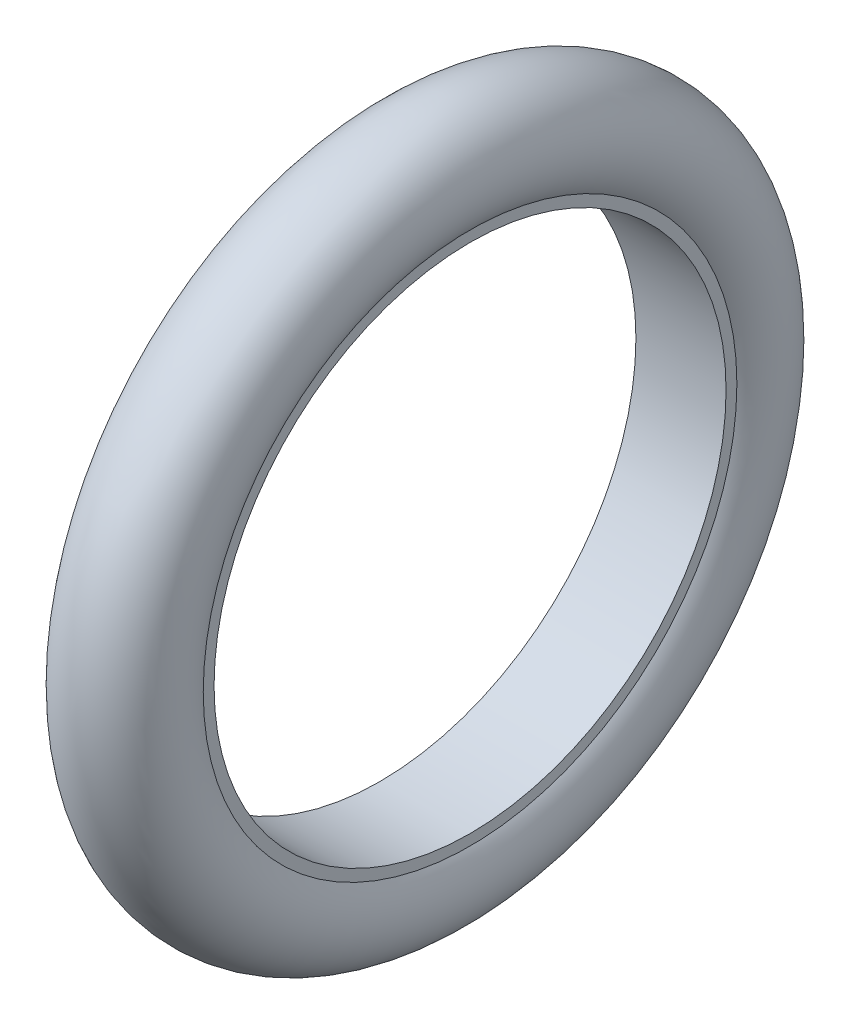
ISO-10303-21;
HEADER;
FILE_DESCRIPTION(('STEP AP214'),'2;1');
FILE_NAME('part.step','',(''),(''),'','','');
FILE_SCHEMA(('AUTOMOTIVE_DESIGN { 1 0 10303 214 1 1 1 1 }'));
ENDSEC;
DATA;
#1=APPLICATION_CONTEXT('core data for automotive mechanical design processes');
#2=APPLICATION_PROTOCOL_DEFINITION('international standard','automotive_design',2000,#1);
#3=PRODUCT_CONTEXT('',#1,'mechanical');
#4=PRODUCT('Part','Part','',(#3));
#5=PRODUCT_RELATED_PRODUCT_CATEGORY('part','',(#4));
#6=PRODUCT_DEFINITION_FORMATION('','',#4);
#7=PRODUCT_DEFINITION_CONTEXT('part definition',#1,'design');
#8=PRODUCT_DEFINITION('design','',#6,#7);
#9=PRODUCT_DEFINITION_SHAPE('','',#8);
#10=(LENGTH_UNIT() NAMED_UNIT(*) SI_UNIT(.MILLI.,.METRE.));
#11=(NAMED_UNIT(*) PLANE_ANGLE_UNIT() SI_UNIT($,.RADIAN.));
#12=(NAMED_UNIT(*) SI_UNIT($,.STERADIAN.) SOLID_ANGLE_UNIT());
#13=UNCERTAINTY_MEASURE_WITH_UNIT(LENGTH_MEASURE(1.E-05),#10,'distance_accuracy_value','');
#14=(GEOMETRIC_REPRESENTATION_CONTEXT(3) GLOBAL_UNCERTAINTY_ASSIGNED_CONTEXT((#13)) GLOBAL_UNIT_ASSIGNED_CONTEXT((#10,
#11,#12)) REPRESENTATION_CONTEXT('',''));
#15=CARTESIAN_POINT('',(0.,0.,0.));
#16=DIRECTION('',(0.,0.,1.));
#17=DIRECTION('',(1.,0.,0.));
#18=AXIS2_PLACEMENT_3D('',#15,#16,#17);
#19=CARTESIAN_POINT('',(0.,0.,0.));
#20=DIRECTION('',(-1.,0.,0.));
#21=DIRECTION('',(0.,0.,1.));
#22=AXIS2_PLACEMENT_3D('',#19,#20,#21);
#23=TOROIDAL_SURFACE('',#22,83.1651513899117,15.5);
#24=CARTESIAN_POINT('',(-12.5,0.,0.));
#25=DIRECTION('',(-1.,0.,0.));
#26=DIRECTION('',(0.,0.,1.));
#27=AXIS2_PLACEMENT_3D('',#24,#25,#26);
#28=CIRCLE('',#27,74.);
#29=CARTESIAN_POINT('',(-12.5,0.,74.));
#30=VERTEX_POINT('',#29);
#31=EDGE_CURVE('E10',#30,#30,#28,.T.);
#32=ORIENTED_EDGE('',*,*,#31,.F.);
#33=EDGE_LOOP('',(#32));
#34=FACE_BOUND('',#33,.T.);
#35=CARTESIAN_POINT('',(12.5,0.,0.));
#36=DIRECTION('',(-1.,0.,0.));
#37=DIRECTION('',(0.,0.,1.));
#38=AXIS2_PLACEMENT_3D('',#35,#36,#37);
#39=CIRCLE('',#38,74.);
#40=CARTESIAN_POINT('',(12.5,0.,74.));
#41=VERTEX_POINT('',#40);
#42=EDGE_CURVE('E58',#41,#41,#39,.T.);
#43=ORIENTED_EDGE('',*,*,#42,.T.);
#44=EDGE_LOOP('',(#43));
#45=FACE_BOUND('',#44,.T.);
#46=ADVANCED_FACE('F43',(#34,#45),#23,.T.);
#47=CARTESIAN_POINT('',(-12.5,74.,0.));
#48=DIRECTION('',(1.,0.,0.));
#49=DIRECTION('',(0.,0.,-1.));
#50=AXIS2_PLACEMENT_3D('',#47,#48,#49);
#51=PLANE('',#50);
#52=CARTESIAN_POINT('',(-12.5,0.,0.));
#53=DIRECTION('',(-1.,0.,0.));
#54=DIRECTION('',(0.,0.,1.));
#55=AXIS2_PLACEMENT_3D('',#52,#53,#54);
#56=CIRCLE('',#55,71.);
#57=CARTESIAN_POINT('',(-12.5,0.,71.));
#58=VERTEX_POINT('',#57);
#59=EDGE_CURVE('E49',#58,#58,#56,.T.);
#60=ORIENTED_EDGE('',*,*,#59,.F.);
#61=EDGE_LOOP('',(#60));
#62=FACE_BOUND('',#61,.T.);
#63=ORIENTED_EDGE('',*,*,#31,.T.);
#64=EDGE_LOOP('',(#63));
#65=FACE_BOUND('',#64,.T.);
#66=ADVANCED_FACE('F78',(#62,#65),#51,.F.);
#67=CARTESIAN_POINT('',(-32.6304890177472,0.,0.));
#68=DIRECTION('',(-1.,0.,0.));
#69=DIRECTION('',(0.,0.,1.));
#70=AXIS2_PLACEMENT_3D('',#67,#68,#69);
#71=CYLINDRICAL_SURFACE('',#70,71.);
#72=CARTESIAN_POINT('',(12.5,0.,0.));
#73=DIRECTION('',(-1.,0.,0.));
#74=DIRECTION('',(0.,0.,1.));
#75=AXIS2_PLACEMENT_3D('',#72,#73,#74);
#76=CIRCLE('',#75,71.);
#77=CARTESIAN_POINT('',(12.5,0.,71.));
#78=VERTEX_POINT('',#77);
#79=EDGE_CURVE('E54',#78,#78,#76,.T.);
#80=ORIENTED_EDGE('',*,*,#79,.F.);
#81=EDGE_LOOP('',(#80));
#82=FACE_BOUND('',#81,.T.);
#83=ORIENTED_EDGE('',*,*,#59,.T.);
#84=EDGE_LOOP('',(#83));
#85=FACE_BOUND('',#84,.T.);
#86=ADVANCED_FACE('F71',(#82,#85),#71,.F.);
#87=CARTESIAN_POINT('',(12.5,71.,0.));
#88=DIRECTION('',(-1.,0.,0.));
#89=DIRECTION('',(0.,0.,1.));
#90=AXIS2_PLACEMENT_3D('',#87,#88,#89);
#91=PLANE('',#90);
#92=ORIENTED_EDGE('',*,*,#42,.F.);
#93=EDGE_LOOP('',(#92));
#94=FACE_BOUND('',#93,.T.);
#95=ORIENTED_EDGE('',*,*,#79,.T.);
#96=EDGE_LOOP('',(#95));
#97=FACE_BOUND('',#96,.T.);
#98=ADVANCED_FACE('F66',(#94,#97),#91,.F.);
#99=CLOSED_SHELL('',(#46,#66,#86,#98));
#100=MANIFOLD_SOLID_BREP('B2',#99);
#101=ADVANCED_BREP_SHAPE_REPRESENTATION('',(#18,#100),#14);
#102=SHAPE_DEFINITION_REPRESENTATION(#9,#101);
ENDSEC;
END-ISO-10303-21;
